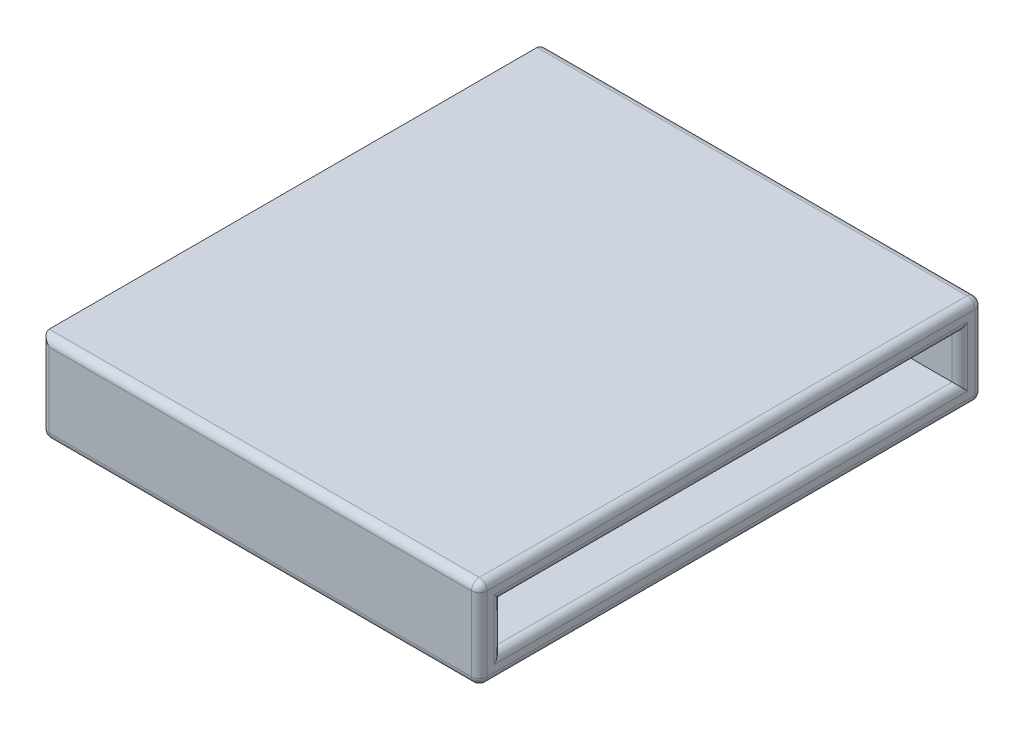
ISO-10303-21;
HEADER;
FILE_DESCRIPTION(('STEP AP214'),'2;1');
FILE_NAME('part.step','',(''),(''),'','','');
FILE_SCHEMA(('AUTOMOTIVE_DESIGN { 1 0 10303 214 1 1 1 1 }'));
ENDSEC;
DATA;
#1=APPLICATION_CONTEXT('core data for automotive mechanical design processes');
#2=APPLICATION_PROTOCOL_DEFINITION('international standard','automotive_design',2000,#1);
#3=PRODUCT_CONTEXT('',#1,'mechanical');
#4=PRODUCT('Part','Part','',(#3));
#5=PRODUCT_RELATED_PRODUCT_CATEGORY('part','',(#4));
#6=PRODUCT_DEFINITION_FORMATION('','',#4);
#7=PRODUCT_DEFINITION_CONTEXT('part definition',#1,'design');
#8=PRODUCT_DEFINITION('design','',#6,#7);
#9=PRODUCT_DEFINITION_SHAPE('','',#8);
#10=(LENGTH_UNIT() NAMED_UNIT(*) SI_UNIT(.MILLI.,.METRE.));
#11=(NAMED_UNIT(*) PLANE_ANGLE_UNIT() SI_UNIT($,.RADIAN.));
#12=(NAMED_UNIT(*) SI_UNIT($,.STERADIAN.) SOLID_ANGLE_UNIT());
#13=UNCERTAINTY_MEASURE_WITH_UNIT(LENGTH_MEASURE(1.E-05),#10,'distance_accuracy_value','');
#14=(GEOMETRIC_REPRESENTATION_CONTEXT(3) GLOBAL_UNCERTAINTY_ASSIGNED_CONTEXT((#13)) GLOBAL_UNIT_ASSIGNED_CONTEXT((#10,
#11,#12)) REPRESENTATION_CONTEXT('',''));
#15=CARTESIAN_POINT('',(0.,0.,0.));
#16=DIRECTION('',(0.,0.,1.));
#17=DIRECTION('',(1.,0.,0.));
#18=AXIS2_PLACEMENT_3D('',#15,#16,#17);
#19=CARTESIAN_POINT('',(0.,11.5,0.));
#20=DIRECTION('',(0.,1.,0.));
#21=DIRECTION('',(0.,0.,1.));
#22=AXIS2_PLACEMENT_3D('',#19,#20,#21);
#23=PLANE('',#22);
#24=DIRECTION('',(0.,0.,-1.));
#25=VECTOR('',#24,1.);
#26=CARTESIAN_POINT('',(-28.,11.5,0.));
#27=LINE('',#26,#25);
#28=CARTESIAN_POINT('',(-28.,11.5,31.185));
#29=VERTEX_POINT('',#28);
#30=CARTESIAN_POINT('',(-28.,11.5,-31.185));
#31=VERTEX_POINT('',#30);
#32=EDGE_CURVE('E304',#29,#31,#27,.T.);
#33=ORIENTED_EDGE('',*,*,#32,.F.);
#34=DIRECTION('',(1.,0.,0.));
#35=VECTOR('',#34,1.);
#36=CARTESIAN_POINT('',(28.,11.5,31.185));
#37=LINE('',#36,#35);
#38=CARTESIAN_POINT('',(27.,11.5,31.185));
#39=VERTEX_POINT('',#38);
#40=EDGE_CURVE('E353',#29,#39,#37,.T.);
#41=ORIENTED_EDGE('',*,*,#40,.T.);
#42=DIRECTION('',(0.,0.,-1.));
#43=VECTOR('',#42,1.);
#44=CARTESIAN_POINT('',(27.,11.5,-32.185));
#45=LINE('',#44,#43);
#46=CARTESIAN_POINT('',(27.,11.5,-31.185));
#47=VERTEX_POINT('',#46);
#48=EDGE_CURVE('E349',#39,#47,#45,.T.);
#49=ORIENTED_EDGE('',*,*,#48,.T.);
#50=DIRECTION('',(1.,0.,0.));
#51=VECTOR('',#50,1.);
#52=CARTESIAN_POINT('',(0.,11.5,-31.185));
#53=LINE('',#52,#51);
#54=EDGE_CURVE('E346',#47,#31,#53,.F.);
#55=ORIENTED_EDGE('',*,*,#54,.T.);
#56=EDGE_LOOP('',(#33,#41,#49,#55));
#57=FACE_BOUND('',#56,.T.);
#58=ADVANCED_FACE('F119',(#57),#23,.T.);
#59=CARTESIAN_POINT('',(0.,0.,0.));
#60=DIRECTION('',(0.,1.,0.));
#61=DIRECTION('',(0.,0.,1.));
#62=AXIS2_PLACEMENT_3D('',#59,#60,#61);
#63=PLANE('',#62);
#64=DIRECTION('',(0.,0.,-1.));
#65=VECTOR('',#64,1.);
#66=CARTESIAN_POINT('',(27.,0.,0.));
#67=LINE('',#66,#65);
#68=CARTESIAN_POINT('',(27.,0.,-31.185));
#69=VERTEX_POINT('',#68);
#70=CARTESIAN_POINT('',(27.,0.,31.185));
#71=VERTEX_POINT('',#70);
#72=EDGE_CURVE('E397',#69,#71,#67,.F.);
#73=ORIENTED_EDGE('',*,*,#72,.T.);
#74=DIRECTION('',(1.,0.,0.));
#75=VECTOR('',#74,1.);
#76=CARTESIAN_POINT('',(0.,0.,31.185));
#77=LINE('',#76,#75);
#78=CARTESIAN_POINT('',(-27.,0.,31.185));
#79=VERTEX_POINT('',#78);
#80=EDGE_CURVE('E400',#71,#79,#77,.F.);
#81=ORIENTED_EDGE('',*,*,#80,.T.);
#82=DIRECTION('',(0.,0.,-1.));
#83=VECTOR('',#82,1.);
#84=CARTESIAN_POINT('',(-27.,0.,-32.185));
#85=LINE('',#84,#83);
#86=CARTESIAN_POINT('',(-27.,0.,-31.185));
#87=VERTEX_POINT('',#86);
#88=EDGE_CURVE('E394',#79,#87,#85,.T.);
#89=ORIENTED_EDGE('',*,*,#88,.T.);
#90=DIRECTION('',(1.,0.,0.));
#91=VECTOR('',#90,1.);
#92=CARTESIAN_POINT('',(28.,0.,-31.185));
#93=LINE('',#92,#91);
#94=EDGE_CURVE('E391',#87,#69,#93,.T.);
#95=ORIENTED_EDGE('',*,*,#94,.T.);
#96=EDGE_LOOP('',(#73,#81,#89,#95));
#97=FACE_BOUND('',#96,.T.);
#98=ADVANCED_FACE('F554',(#97),#63,.F.);
#99=CARTESIAN_POINT('',(0.,11.5,32.185));
#100=DIRECTION('',(0.,0.,-1.));
#101=DIRECTION('',(-1.,0.,0.));
#102=AXIS2_PLACEMENT_3D('',#99,#100,#101);
#103=PLANE('',#102);
#104=DIRECTION('',(1.,0.,0.));
#105=VECTOR('',#104,1.);
#106=CARTESIAN_POINT('',(-28.,10.5,32.185));
#107=LINE('',#106,#105);
#108=CARTESIAN_POINT('',(27.,10.5,32.185));
#109=VERTEX_POINT('',#108);
#110=CARTESIAN_POINT('',(-27.,10.5,32.185));
#111=VERTEX_POINT('',#110);
#112=EDGE_CURVE('E362',#109,#111,#107,.F.);
#113=ORIENTED_EDGE('',*,*,#112,.T.);
#114=DIRECTION('',(0.,-1.,0.));
#115=VECTOR('',#114,1.);
#116=CARTESIAN_POINT('',(-27.,0.,32.185));
#117=LINE('',#116,#115);
#118=CARTESIAN_POINT('',(-27.,1.,32.185));
#119=VERTEX_POINT('',#118);
#120=EDGE_CURVE('E365',#111,#119,#117,.T.);
#121=ORIENTED_EDGE('',*,*,#120,.T.);
#122=DIRECTION('',(1.,0.,0.));
#123=VECTOR('',#122,1.);
#124=CARTESIAN_POINT('',(0.,1.,32.185));
#125=LINE('',#124,#123);
#126=CARTESIAN_POINT('',(27.,1.,32.185));
#127=VERTEX_POINT('',#126);
#128=EDGE_CURVE('E356',#119,#127,#125,.T.);
#129=ORIENTED_EDGE('',*,*,#128,.T.);
#130=DIRECTION('',(0.,-1.,0.));
#131=VECTOR('',#130,1.);
#132=CARTESIAN_POINT('',(27.,11.5,32.185));
#133=LINE('',#132,#131);
#134=EDGE_CURVE('E359',#127,#109,#133,.F.);
#135=ORIENTED_EDGE('',*,*,#134,.T.);
#136=EDGE_LOOP('',(#113,#121,#129,#135));
#137=FACE_BOUND('',#136,.T.);
#138=ADVANCED_FACE('F557',(#137),#103,.F.);
#139=CARTESIAN_POINT('',(28.,11.5,0.));
#140=DIRECTION('',(-1.,0.,0.));
#141=DIRECTION('',(0.,0.,1.));
#142=AXIS2_PLACEMENT_3D('',#139,#140,#141);
#143=PLANE('',#142);
#144=DIRECTION('',(0.,1.,0.));
#145=VECTOR('',#144,1.);
#146=CARTESIAN_POINT('',(28.,11.5,30.285));
#147=LINE('',#146,#145);
#148=CARTESIAN_POINT('',(28.,1.9,30.285));
#149=VERTEX_POINT('',#148);
#150=CARTESIAN_POINT('',(28.,9.6,30.285));
#151=VERTEX_POINT('',#150);
#152=EDGE_CURVE('E328',#149,#151,#147,.T.);
#153=ORIENTED_EDGE('',*,*,#152,.T.);
#154=DIRECTION('',(0.,0.,1.));
#155=VECTOR('',#154,1.);
#156=CARTESIAN_POINT('',(28.,9.6,-29.285));
#157=LINE('',#156,#155);
#158=CARTESIAN_POINT('',(28.,9.6,-30.285));
#159=VERTEX_POINT('',#158);
#160=EDGE_CURVE('E258',#151,#159,#157,.F.);
#161=ORIENTED_EDGE('',*,*,#160,.T.);
#162=DIRECTION('',(0.,1.,0.));
#163=VECTOR('',#162,1.);
#164=CARTESIAN_POINT('',(28.,2.9,-30.285));
#165=LINE('',#164,#163);
#166=CARTESIAN_POINT('',(28.,1.9,-30.285));
#167=VERTEX_POINT('',#166);
#168=EDGE_CURVE('E322',#159,#167,#165,.F.);
#169=ORIENTED_EDGE('',*,*,#168,.T.);
#170=DIRECTION('',(0.,0.,1.));
#171=VECTOR('',#170,1.);
#172=CARTESIAN_POINT('',(28.,1.9,0.));
#173=LINE('',#172,#171);
#174=EDGE_CURVE('E325',#167,#149,#173,.T.);
#175=ORIENTED_EDGE('',*,*,#174,.T.);
#176=EDGE_LOOP('',(#153,#161,#169,#175));
#177=FACE_BOUND('',#176,.T.);
#178=DIRECTION('',(0.,-1.,0.));
#179=VECTOR('',#178,1.);
#180=CARTESIAN_POINT('',(28.,11.5,-31.185));
#181=LINE('',#180,#179);
#182=CARTESIAN_POINT('',(28.,1.,-31.185));
#183=VERTEX_POINT('',#182);
#184=CARTESIAN_POINT('',(28.,10.5,-31.185));
#185=VERTEX_POINT('',#184);
#186=EDGE_CURVE('E287',#183,#185,#181,.F.);
#187=ORIENTED_EDGE('',*,*,#186,.T.);
#188=DIRECTION('',(0.,0.,-1.));
#189=VECTOR('',#188,1.);
#190=CARTESIAN_POINT('',(28.,10.5,32.185));
#191=LINE('',#190,#189);
#192=CARTESIAN_POINT('',(28.,10.5,31.185));
#193=VERTEX_POINT('',#192);
#194=EDGE_CURVE('E318',#185,#193,#191,.F.);
#195=ORIENTED_EDGE('',*,*,#194,.T.);
#196=DIRECTION('',(0.,-1.,0.));
#197=VECTOR('',#196,1.);
#198=CARTESIAN_POINT('',(28.,11.5,31.185));
#199=LINE('',#198,#197);
#200=CARTESIAN_POINT('',(28.,1.,31.185));
#201=VERTEX_POINT('',#200);
#202=EDGE_CURVE('E315',#193,#201,#199,.T.);
#203=ORIENTED_EDGE('',*,*,#202,.T.);
#204=DIRECTION('',(0.,0.,-1.));
#205=VECTOR('',#204,1.);
#206=CARTESIAN_POINT('',(28.,1.,0.));
#207=LINE('',#206,#205);
#208=EDGE_CURVE('E312',#201,#183,#207,.T.);
#209=ORIENTED_EDGE('',*,*,#208,.T.);
#210=EDGE_LOOP('',(#187,#195,#203,#209));
#211=FACE_BOUND('',#210,.T.);
#212=ADVANCED_FACE('F534',(#177,#211),#143,.F.);
#213=CARTESIAN_POINT('',(0.,11.5,-32.185));
#214=DIRECTION('',(0.,0.,-1.));
#215=DIRECTION('',(-1.,0.,0.));
#216=AXIS2_PLACEMENT_3D('',#213,#214,#215);
#217=PLANE('',#216);
#218=DIRECTION('',(1.,0.,0.));
#219=VECTOR('',#218,1.);
#220=CARTESIAN_POINT('',(0.,10.5,-32.185));
#221=LINE('',#220,#219);
#222=CARTESIAN_POINT('',(-27.,10.5,-32.185));
#223=VERTEX_POINT('',#222);
#224=CARTESIAN_POINT('',(27.,10.5,-32.185));
#225=VERTEX_POINT('',#224);
#226=EDGE_CURVE('E129',#223,#225,#221,.T.);
#227=ORIENTED_EDGE('',*,*,#226,.T.);
#228=DIRECTION('',(0.,-1.,0.));
#229=VECTOR('',#228,1.);
#230=CARTESIAN_POINT('',(27.,0.,-32.185));
#231=LINE('',#230,#229);
#232=CARTESIAN_POINT('',(27.,1.,-32.185));
#233=VERTEX_POINT('',#232);
#234=EDGE_CURVE('E12',#225,#233,#231,.T.);
#235=ORIENTED_EDGE('',*,*,#234,.T.);
#236=DIRECTION('',(1.,0.,0.));
#237=VECTOR('',#236,1.);
#238=CARTESIAN_POINT('',(-28.,1.,-32.185));
#239=LINE('',#238,#237);
#240=CARTESIAN_POINT('',(-27.,1.,-32.185));
#241=VERTEX_POINT('',#240);
#242=EDGE_CURVE('E404',#233,#241,#239,.F.);
#243=ORIENTED_EDGE('',*,*,#242,.T.);
#244=DIRECTION('',(0.,-1.,0.));
#245=VECTOR('',#244,1.);
#246=CARTESIAN_POINT('',(-27.,11.5,-32.185));
#247=LINE('',#246,#245);
#248=EDGE_CURVE('E140',#241,#223,#247,.F.);
#249=ORIENTED_EDGE('',*,*,#248,.T.);
#250=EDGE_LOOP('',(#227,#235,#243,#249));
#251=FACE_BOUND('',#250,.T.);
#252=ADVANCED_FACE('F549',(#251),#217,.T.);
#253=CARTESIAN_POINT('',(-28.,11.5,0.));
#254=DIRECTION('',(-1.,0.,0.));
#255=DIRECTION('',(0.,0.,1.));
#256=AXIS2_PLACEMENT_3D('',#253,#254,#255);
#257=PLANE('',#256);
#258=DIRECTION('',(0.,0.,1.));
#259=VECTOR('',#258,1.);
#260=CARTESIAN_POINT('',(-28.,9.6,0.));
#261=LINE('',#260,#259);
#262=CARTESIAN_POINT('',(-28.,9.6,-30.285));
#263=VERTEX_POINT('',#262);
#264=CARTESIAN_POINT('',(-28.,9.6,30.285));
#265=VERTEX_POINT('',#264);
#266=EDGE_CURVE('E375',#263,#265,#261,.T.);
#267=ORIENTED_EDGE('',*,*,#266,.T.);
#268=DIRECTION('',(0.,1.,0.));
#269=VECTOR('',#268,1.);
#270=CARTESIAN_POINT('',(-28.,2.9,30.285));
#271=LINE('',#270,#269);
#272=CARTESIAN_POINT('',(-28.,1.9,30.285));
#273=VERTEX_POINT('',#272);
#274=EDGE_CURVE('E378',#265,#273,#271,.F.);
#275=ORIENTED_EDGE('',*,*,#274,.T.);
#276=DIRECTION('',(0.,0.,1.));
#277=VECTOR('',#276,1.);
#278=CARTESIAN_POINT('',(-28.,1.9,-29.285));
#279=LINE('',#278,#277);
#280=CARTESIAN_POINT('',(-28.,1.9,-30.285));
#281=VERTEX_POINT('',#280);
#282=EDGE_CURVE('E369',#273,#281,#279,.F.);
#283=ORIENTED_EDGE('',*,*,#282,.T.);
#284=DIRECTION('',(0.,1.,0.));
#285=VECTOR('',#284,1.);
#286=CARTESIAN_POINT('',(-28.,11.5,-30.285));
#287=LINE('',#286,#285);
#288=EDGE_CURVE('E372',#281,#263,#287,.T.);
#289=ORIENTED_EDGE('',*,*,#288,.T.);
#290=EDGE_LOOP('',(#267,#275,#283,#289));
#291=FACE_BOUND('',#290,.T.);
#292=DIRECTION('',(0.,0.,-1.));
#293=VECTOR('',#292,1.);
#294=CARTESIAN_POINT('',(-28.,1.,32.185));
#295=LINE('',#294,#293);
#296=CARTESIAN_POINT('',(-28.,1.,-31.185));
#297=VERTEX_POINT('',#296);
#298=CARTESIAN_POINT('',(-28.,1.,31.185));
#299=VERTEX_POINT('',#298);
#300=EDGE_CURVE('E385',#297,#299,#295,.F.);
#301=ORIENTED_EDGE('',*,*,#300,.T.);
#302=DIRECTION('',(0.,-1.,0.));
#303=VECTOR('',#302,1.);
#304=CARTESIAN_POINT('',(-28.,11.5,31.185));
#305=LINE('',#304,#303);
#306=EDGE_CURVE('E388',#299,#29,#305,.F.);
#307=ORIENTED_EDGE('',*,*,#306,.T.);
#308=ORIENTED_EDGE('',*,*,#32,.T.);
#309=DIRECTION('',(0.,-1.,0.));
#310=VECTOR('',#309,1.);
#311=CARTESIAN_POINT('',(-28.,11.5,-31.185));
#312=LINE('',#311,#310);
#313=EDGE_CURVE('E382',#31,#297,#312,.T.);
#314=ORIENTED_EDGE('',*,*,#313,.T.);
#315=EDGE_LOOP('',(#301,#307,#308,#314));
#316=FACE_BOUND('',#315,.T.);
#317=ADVANCED_FACE('F516',(#291,#316),#257,.T.);
#318=CARTESIAN_POINT('',(75.,2.9,0.));
#319=DIRECTION('',(0.,-1.,0.));
#320=DIRECTION('',(0.,0.,-1.));
#321=AXIS2_PLACEMENT_3D('',#318,#319,#320);
#322=PLANE('',#321);
#323=DIRECTION('',(-1.,0.,0.));
#324=VECTOR('',#323,1.);
#325=CARTESIAN_POINT('',(75.,2.9,29.285));
#326=LINE('',#325,#324);
#327=CARTESIAN_POINT('',(27.,2.9,29.285));
#328=VERTEX_POINT('',#327);
#329=CARTESIAN_POINT('',(-27.,2.9,29.285));
#330=VERTEX_POINT('',#329);
#331=EDGE_CURVE('E294',#328,#330,#326,.T.);
#332=ORIENTED_EDGE('',*,*,#331,.F.);
#333=DIRECTION('',(0.,0.,1.));
#334=VECTOR('',#333,1.);
#335=CARTESIAN_POINT('',(27.,2.9,0.));
#336=LINE('',#335,#334);
#337=CARTESIAN_POINT('',(27.,2.9,-29.285));
#338=VERTEX_POINT('',#337);
#339=EDGE_CURVE('E337',#328,#338,#336,.F.);
#340=ORIENTED_EDGE('',*,*,#339,.T.);
#341=DIRECTION('',(-1.,0.,0.));
#342=VECTOR('',#341,1.);
#343=CARTESIAN_POINT('',(75.,2.9,-29.285));
#344=LINE('',#343,#342);
#345=CARTESIAN_POINT('',(-27.,2.9,-29.285));
#346=VERTEX_POINT('',#345);
#347=EDGE_CURVE('E298',#338,#346,#344,.T.);
#348=ORIENTED_EDGE('',*,*,#347,.T.);
#349=DIRECTION('',(0.,0.,1.));
#350=VECTOR('',#349,1.);
#351=CARTESIAN_POINT('',(-27.,2.9,29.285));
#352=LINE('',#351,#350);
#353=EDGE_CURVE('E275',#346,#330,#352,.T.);
#354=ORIENTED_EDGE('',*,*,#353,.T.);
#355=EDGE_LOOP('',(#332,#340,#348,#354));
#356=FACE_BOUND('',#355,.T.);
#357=ADVANCED_FACE('F540',(#356),#322,.F.);
#358=CARTESIAN_POINT('',(75.,0.,-29.285));
#359=DIRECTION('',(0.,0.,1.));
#360=DIRECTION('',(1.,0.,0.));
#361=AXIS2_PLACEMENT_3D('',#358,#359,#360);
#362=PLANE('',#361);
#363=ORIENTED_EDGE('',*,*,#347,.F.);
#364=DIRECTION('',(0.,1.,0.));
#365=VECTOR('',#364,1.);
#366=CARTESIAN_POINT('',(27.,8.6,-29.285));
#367=LINE('',#366,#365);
#368=CARTESIAN_POINT('',(27.,8.6,-29.285));
#369=VERTEX_POINT('',#368);
#370=EDGE_CURVE('E343',#338,#369,#367,.T.);
#371=ORIENTED_EDGE('',*,*,#370,.T.);
#372=DIRECTION('',(-1.,0.,0.));
#373=VECTOR('',#372,1.);
#374=CARTESIAN_POINT('',(75.,8.6,-29.285));
#375=LINE('',#374,#373);
#376=CARTESIAN_POINT('',(-27.,8.6,-29.285));
#377=VERTEX_POINT('',#376);
#378=EDGE_CURVE('E284',#369,#377,#375,.T.);
#379=ORIENTED_EDGE('',*,*,#378,.T.);
#380=DIRECTION('',(0.,1.,0.));
#381=VECTOR('',#380,1.);
#382=CARTESIAN_POINT('',(-27.,0.,-29.285));
#383=LINE('',#382,#381);
#384=EDGE_CURVE('E340',#377,#346,#383,.F.);
#385=ORIENTED_EDGE('',*,*,#384,.T.);
#386=EDGE_LOOP('',(#363,#371,#379,#385));
#387=FACE_BOUND('',#386,.T.);
#388=ADVANCED_FACE('F525',(#387),#362,.T.);
#389=CARTESIAN_POINT('',(75.,8.6,0.));
#390=DIRECTION('',(0.,-1.,0.));
#391=DIRECTION('',(0.,0.,-1.));
#392=AXIS2_PLACEMENT_3D('',#389,#390,#391);
#393=PLANE('',#392);
#394=ORIENTED_EDGE('',*,*,#378,.F.);
#395=DIRECTION('',(0.,0.,1.));
#396=VECTOR('',#395,1.);
#397=CARTESIAN_POINT('',(27.,8.6,29.285));
#398=LINE('',#397,#396);
#399=CARTESIAN_POINT('',(27.,8.6,29.285));
#400=VERTEX_POINT('',#399);
#401=EDGE_CURVE('E256',#369,#400,#398,.T.);
#402=ORIENTED_EDGE('',*,*,#401,.T.);
#403=DIRECTION('',(-1.,0.,0.));
#404=VECTOR('',#403,1.);
#405=CARTESIAN_POINT('',(75.,8.6,29.285));
#406=LINE('',#405,#404);
#407=CARTESIAN_POINT('',(-27.,8.6,29.285));
#408=VERTEX_POINT('',#407);
#409=EDGE_CURVE('E282',#400,#408,#406,.T.);
#410=ORIENTED_EDGE('',*,*,#409,.T.);
#411=DIRECTION('',(0.,0.,1.));
#412=VECTOR('',#411,1.);
#413=CARTESIAN_POINT('',(-27.,8.6,0.));
#414=LINE('',#413,#412);
#415=EDGE_CURVE('E288',#408,#377,#414,.F.);
#416=ORIENTED_EDGE('',*,*,#415,.T.);
#417=EDGE_LOOP('',(#394,#402,#410,#416));
#418=FACE_BOUND('',#417,.T.);
#419=ADVANCED_FACE('F281',(#418),#393,.T.);
#420=CARTESIAN_POINT('',(75.,0.,29.285));
#421=DIRECTION('',(0.,0.,1.));
#422=DIRECTION('',(1.,0.,0.));
#423=AXIS2_PLACEMENT_3D('',#420,#421,#422);
#424=PLANE('',#423);
#425=ORIENTED_EDGE('',*,*,#409,.F.);
#426=DIRECTION('',(0.,1.,0.));
#427=VECTOR('',#426,1.);
#428=CARTESIAN_POINT('',(27.,0.,29.285));
#429=LINE('',#428,#427);
#430=EDGE_CURVE('E266',#400,#328,#429,.F.);
#431=ORIENTED_EDGE('',*,*,#430,.T.);
#432=ORIENTED_EDGE('',*,*,#331,.T.);
#433=DIRECTION('',(0.,1.,0.));
#434=VECTOR('',#433,1.);
#435=CARTESIAN_POINT('',(-27.,8.6,29.285));
#436=LINE('',#435,#434);
#437=EDGE_CURVE('E276',#330,#408,#436,.T.);
#438=ORIENTED_EDGE('',*,*,#437,.T.);
#439=EDGE_LOOP('',(#425,#431,#432,#438));
#440=FACE_BOUND('',#439,.T.);
#441=ADVANCED_FACE('F291',(#440),#424,.F.);
#442=CARTESIAN_POINT('',(27.,1.9,0.));
#443=DIRECTION('',(0.,0.,1.));
#444=DIRECTION('',(1.,0.,0.));
#445=AXIS2_PLACEMENT_3D('',#442,#443,#444);
#446=CYLINDRICAL_SURFACE('',#445,1.);
#447=CARTESIAN_POINT('',(27.,1.9,30.285));
#448=DIRECTION('',(0.,0.707106781186547,0.707106781186547));
#449=DIRECTION('',(0.,0.707106781186547,-0.707106781186547));
#450=AXIS2_PLACEMENT_3D('',#447,#448,#449);
#451=ELLIPSE('',#450,1.41421356237309,1.);
#452=EDGE_CURVE('E269',#149,#328,#451,.T.);
#453=ORIENTED_EDGE('',*,*,#452,.F.);
#454=ORIENTED_EDGE('',*,*,#174,.F.);
#455=CARTESIAN_POINT('',(27.,1.9,-30.285));
#456=DIRECTION('',(0.,-0.707106781186547,0.707106781186547));
#457=DIRECTION('',(0.,0.707106781186547,0.707106781186547));
#458=AXIS2_PLACEMENT_3D('',#455,#456,#457);
#459=ELLIPSE('',#458,1.41421356237309,1.);
#460=EDGE_CURVE('E300',#338,#167,#459,.F.);
#461=ORIENTED_EDGE('',*,*,#460,.F.);
#462=ORIENTED_EDGE('',*,*,#339,.F.);
#463=EDGE_LOOP('',(#453,#454,#461,#462));
#464=FACE_BOUND('',#463,.T.);
#465=ADVANCED_FACE('F538',(#464),#446,.T.);
#466=CARTESIAN_POINT('',(27.,0.,-30.285));
#467=DIRECTION('',(0.,-1.,0.));
#468=DIRECTION('',(0.,0.,-1.));
#469=AXIS2_PLACEMENT_3D('',#466,#467,#468);
#470=CYLINDRICAL_SURFACE('',#469,1.);
#471=ORIENTED_EDGE('',*,*,#460,.T.);
#472=ORIENTED_EDGE('',*,*,#168,.F.);
#473=CARTESIAN_POINT('',(27.,9.6,-30.285));
#474=DIRECTION('',(0.,-0.707106781186547,-0.707106781186547));
#475=DIRECTION('',(0.,0.707106781186547,-0.707106781186547));
#476=AXIS2_PLACEMENT_3D('',#473,#474,#475);
#477=ELLIPSE('',#476,1.41421356237309,1.);
#478=EDGE_CURVE('E262',#369,#159,#477,.F.);
#479=ORIENTED_EDGE('',*,*,#478,.F.);
#480=ORIENTED_EDGE('',*,*,#370,.F.);
#481=EDGE_LOOP('',(#471,#472,#479,#480));
#482=FACE_BOUND('',#481,.T.);
#483=ADVANCED_FACE('F530',(#482),#470,.T.);
#484=CARTESIAN_POINT('',(27.,11.5,30.285));
#485=DIRECTION('',(0.,1.,0.));
#486=DIRECTION('',(0.,0.,1.));
#487=AXIS2_PLACEMENT_3D('',#484,#485,#486);
#488=CYLINDRICAL_SURFACE('',#487,1.);
#489=ORIENTED_EDGE('',*,*,#452,.T.);
#490=ORIENTED_EDGE('',*,*,#430,.F.);
#491=CARTESIAN_POINT('',(27.,9.6,30.285));
#492=DIRECTION('',(0.,0.707106781186547,-0.707106781186547));
#493=DIRECTION('',(0.,-0.707106781186547,-0.707106781186547));
#494=AXIS2_PLACEMENT_3D('',#491,#492,#493);
#495=ELLIPSE('',#494,1.41421356237309,1.);
#496=EDGE_CURVE('E252',#151,#400,#495,.T.);
#497=ORIENTED_EDGE('',*,*,#496,.F.);
#498=ORIENTED_EDGE('',*,*,#152,.F.);
#499=EDGE_LOOP('',(#489,#490,#497,#498));
#500=FACE_BOUND('',#499,.T.);
#501=ADVANCED_FACE('F267',(#500),#488,.T.);
#502=CARTESIAN_POINT('',(27.,9.6,0.));
#503=DIRECTION('',(0.,0.,-1.));
#504=DIRECTION('',(-1.,0.,0.));
#505=AXIS2_PLACEMENT_3D('',#502,#503,#504);
#506=CYLINDRICAL_SURFACE('',#505,1.);
#507=ORIENTED_EDGE('',*,*,#478,.T.);
#508=ORIENTED_EDGE('',*,*,#160,.F.);
#509=ORIENTED_EDGE('',*,*,#496,.T.);
#510=ORIENTED_EDGE('',*,*,#401,.F.);
#511=EDGE_LOOP('',(#507,#508,#509,#510));
#512=FACE_BOUND('',#511,.T.);
#513=ADVANCED_FACE('F254',(#512),#506,.T.);
#514=CARTESIAN_POINT('',(-27.,1.,0.));
#515=DIRECTION('',(0.,0.,1.));
#516=DIRECTION('',(1.,0.,0.));
#517=AXIS2_PLACEMENT_3D('',#514,#515,#516);
#518=CYLINDRICAL_SURFACE('',#517,1.);
#519=CARTESIAN_POINT('',(-27.,1.,-31.185));
#520=DIRECTION('',(0.,0.,-1.));
#521=DIRECTION('',(-1.,0.,0.));
#522=AXIS2_PLACEMENT_3D('',#519,#520,#521);
#523=CIRCLE('',#522,1.);
#524=EDGE_CURVE('E482',#87,#297,#523,.T.);
#525=ORIENTED_EDGE('',*,*,#524,.F.);
#526=ORIENTED_EDGE('',*,*,#88,.F.);
#527=CARTESIAN_POINT('',(-27.,1.,31.185));
#528=DIRECTION('',(0.,0.,1.));
#529=DIRECTION('',(1.,0.,0.));
#530=AXIS2_PLACEMENT_3D('',#527,#528,#529);
#531=CIRCLE('',#530,1.);
#532=EDGE_CURVE('E486',#299,#79,#531,.T.);
#533=ORIENTED_EDGE('',*,*,#532,.F.);
#534=ORIENTED_EDGE('',*,*,#300,.F.);
#535=EDGE_LOOP('',(#525,#526,#533,#534));
#536=FACE_BOUND('',#535,.T.);
#537=ADVANCED_FACE('F572',(#536),#518,.T.);
#538=CARTESIAN_POINT('',(0.,1.,31.185));
#539=DIRECTION('',(1.,0.,0.));
#540=DIRECTION('',(0.,0.,-1.));
#541=AXIS2_PLACEMENT_3D('',#538,#539,#540);
#542=CYLINDRICAL_SURFACE('',#541,1.);
#543=CARTESIAN_POINT('',(-27.,1.,31.185));
#544=DIRECTION('',(-1.,0.,0.));
#545=DIRECTION('',(0.,0.,1.));
#546=AXIS2_PLACEMENT_3D('',#543,#544,#545);
#547=CIRCLE('',#546,1.);
#548=EDGE_CURVE('E263',#79,#119,#547,.T.);
#549=ORIENTED_EDGE('',*,*,#548,.F.);
#550=ORIENTED_EDGE('',*,*,#80,.F.);
#551=CARTESIAN_POINT('',(27.,1.,31.185));
#552=DIRECTION('',(1.,0.,0.));
#553=DIRECTION('',(0.,0.,-1.));
#554=AXIS2_PLACEMENT_3D('',#551,#552,#553);
#555=CIRCLE('',#554,1.);
#556=EDGE_CURVE('E470',#127,#71,#555,.T.);
#557=ORIENTED_EDGE('',*,*,#556,.F.);
#558=ORIENTED_EDGE('',*,*,#128,.F.);
#559=EDGE_LOOP('',(#549,#550,#557,#558));
#560=FACE_BOUND('',#559,.T.);
#561=ADVANCED_FACE('F638',(#560),#542,.T.);
#562=CARTESIAN_POINT('',(-27.,1.,31.185));
#563=DIRECTION('',(0.,-1.,0.));
#564=DIRECTION('',(0.,0.,-1.));
#565=AXIS2_PLACEMENT_3D('',#562,#563,#564);
#566=SPHERICAL_SURFACE('',#565,1.);
#567=ORIENTED_EDGE('',*,*,#532,.T.);
#568=ORIENTED_EDGE('',*,*,#548,.T.);
#569=CARTESIAN_POINT('',(-27.,1.,31.185));
#570=DIRECTION('',(0.,-1.,0.));
#571=DIRECTION('',(1.,0.,0.));
#572=AXIS2_PLACEMENT_3D('',#569,#570,#571);
#573=CIRCLE('',#572,1.);
#574=EDGE_CURVE('E467',#299,#119,#573,.F.);
#575=ORIENTED_EDGE('',*,*,#574,.F.);
#576=EDGE_LOOP('',(#567,#568,#575));
#577=FACE_BOUND('',#576,.T.);
#578=ADVANCED_FACE('F634',(#577),#566,.T.);
#579=CARTESIAN_POINT('',(-27.,1.,-31.185));
#580=DIRECTION('',(0.,-1.,0.));
#581=DIRECTION('',(0.,0.,-1.));
#582=AXIS2_PLACEMENT_3D('',#579,#580,#581);
#583=SPHERICAL_SURFACE('',#582,1.);
#584=CARTESIAN_POINT('',(-27.,1.,-31.185));
#585=DIRECTION('',(0.,-1.,0.));
#586=DIRECTION('',(0.,0.,-1.));
#587=AXIS2_PLACEMENT_3D('',#584,#585,#586);
#588=CIRCLE('',#587,1.);
#589=EDGE_CURVE('E463',#241,#297,#588,.F.);
#590=ORIENTED_EDGE('',*,*,#589,.F.);
#591=CARTESIAN_POINT('',(-27.,1.,-31.185));
#592=DIRECTION('',(-1.,0.,0.));
#593=DIRECTION('',(0.,0.,1.));
#594=AXIS2_PLACEMENT_3D('',#591,#592,#593);
#595=CIRCLE('',#594,1.);
#596=EDGE_CURVE('E478',#87,#241,#595,.F.);
#597=ORIENTED_EDGE('',*,*,#596,.F.);
#598=ORIENTED_EDGE('',*,*,#524,.T.);
#599=EDGE_LOOP('',(#590,#597,#598));
#600=FACE_BOUND('',#599,.T.);
#601=ADVANCED_FACE('F630',(#600),#583,.T.);
#602=CARTESIAN_POINT('',(0.,1.,-31.185));
#603=DIRECTION('',(-1.,0.,0.));
#604=DIRECTION('',(0.,0.,1.));
#605=AXIS2_PLACEMENT_3D('',#602,#603,#604);
#606=CYLINDRICAL_SURFACE('',#605,1.);
#607=ORIENTED_EDGE('',*,*,#596,.T.);
#608=ORIENTED_EDGE('',*,*,#242,.F.);
#609=CARTESIAN_POINT('',(27.,1.,-31.185));
#610=DIRECTION('',(1.,0.,0.));
#611=DIRECTION('',(0.,0.,-1.));
#612=AXIS2_PLACEMENT_3D('',#609,#610,#611);
#613=CIRCLE('',#612,1.);
#614=EDGE_CURVE('E459',#69,#233,#613,.T.);
#615=ORIENTED_EDGE('',*,*,#614,.F.);
#616=ORIENTED_EDGE('',*,*,#94,.F.);
#617=EDGE_LOOP('',(#607,#608,#615,#616));
#618=FACE_BOUND('',#617,.T.);
#619=ADVANCED_FACE('F626',(#618),#606,.T.);
#620=CARTESIAN_POINT('',(27.,1.,0.));
#621=DIRECTION('',(0.,0.,-1.));
#622=DIRECTION('',(-1.,0.,0.));
#623=AXIS2_PLACEMENT_3D('',#620,#621,#622);
#624=CYLINDRICAL_SURFACE('',#623,1.);
#625=CARTESIAN_POINT('',(27.,1.,31.185));
#626=DIRECTION('',(0.,0.,1.));
#627=DIRECTION('',(1.,0.,0.));
#628=AXIS2_PLACEMENT_3D('',#625,#626,#627);
#629=CIRCLE('',#628,1.);
#630=EDGE_CURVE('E474',#71,#201,#629,.T.);
#631=ORIENTED_EDGE('',*,*,#630,.F.);
#632=ORIENTED_EDGE('',*,*,#72,.F.);
#633=CARTESIAN_POINT('',(27.,1.,-31.185));
#634=DIRECTION('',(0.,0.,-1.));
#635=DIRECTION('',(-1.,0.,0.));
#636=AXIS2_PLACEMENT_3D('',#633,#634,#635);
#637=CIRCLE('',#636,1.);
#638=EDGE_CURVE('E455',#183,#69,#637,.T.);
#639=ORIENTED_EDGE('',*,*,#638,.F.);
#640=ORIENTED_EDGE('',*,*,#208,.F.);
#641=EDGE_LOOP('',(#631,#632,#639,#640));
#642=FACE_BOUND('',#641,.T.);
#643=ADVANCED_FACE('F622',(#642),#624,.T.);
#644=CARTESIAN_POINT('',(27.,1.,31.185));
#645=DIRECTION('',(0.,-1.,0.));
#646=DIRECTION('',(0.,0.,-1.));
#647=AXIS2_PLACEMENT_3D('',#644,#645,#646);
#648=SPHERICAL_SURFACE('',#647,1.);
#649=ORIENTED_EDGE('',*,*,#556,.T.);
#650=ORIENTED_EDGE('',*,*,#630,.T.);
#651=CARTESIAN_POINT('',(27.,1.,31.185));
#652=DIRECTION('',(0.,-1.,0.));
#653=DIRECTION('',(0.,0.,-1.));
#654=AXIS2_PLACEMENT_3D('',#651,#652,#653);
#655=CIRCLE('',#654,1.);
#656=EDGE_CURVE('E451',#127,#201,#655,.F.);
#657=ORIENTED_EDGE('',*,*,#656,.F.);
#658=EDGE_LOOP('',(#649,#650,#657));
#659=FACE_BOUND('',#658,.T.);
#660=ADVANCED_FACE('F618',(#659),#648,.T.);
#661=CARTESIAN_POINT('',(-27.,11.5,31.185));
#662=DIRECTION('',(0.,1.,0.));
#663=DIRECTION('',(0.,0.,1.));
#664=AXIS2_PLACEMENT_3D('',#661,#662,#663);
#665=CYLINDRICAL_SURFACE('',#664,1.);
#666=ORIENTED_EDGE('',*,*,#574,.T.);
#667=ORIENTED_EDGE('',*,*,#120,.F.);
#668=CARTESIAN_POINT('',(-27.,10.5,31.185));
#669=DIRECTION('',(-0.707106781186547,-0.707106781186547,0.));
#670=DIRECTION('',(-0.707106781186547,0.707106781186547,0.));
#671=AXIS2_PLACEMENT_3D('',#668,#669,#670);
#672=ELLIPSE('',#671,1.41421356237309,1.);
#673=EDGE_CURVE('E447',#29,#111,#672,.F.);
#674=ORIENTED_EDGE('',*,*,#673,.F.);
#675=ORIENTED_EDGE('',*,*,#306,.F.);
#676=EDGE_LOOP('',(#666,#667,#674,#675));
#677=FACE_BOUND('',#676,.T.);
#678=ADVANCED_FACE('F614',(#677),#665,.T.);
#679=CARTESIAN_POINT('',(-27.,11.5,-31.185));
#680=DIRECTION('',(0.,-1.,0.));
#681=DIRECTION('',(0.,0.,-1.));
#682=AXIS2_PLACEMENT_3D('',#679,#680,#681);
#683=CYLINDRICAL_SURFACE('',#682,1.);
#684=ORIENTED_EDGE('',*,*,#589,.T.);
#685=ORIENTED_EDGE('',*,*,#313,.F.);
#686=CARTESIAN_POINT('',(-27.,10.5,-31.185));
#687=DIRECTION('',(-0.707106781186547,-0.707106781186547,0.));
#688=DIRECTION('',(0.707106781186547,-0.707106781186547,0.));
#689=AXIS2_PLACEMENT_3D('',#686,#687,#688);
#690=ELLIPSE('',#689,1.41421356237309,1.);
#691=EDGE_CURVE('E443',#223,#31,#690,.F.);
#692=ORIENTED_EDGE('',*,*,#691,.F.);
#693=ORIENTED_EDGE('',*,*,#248,.F.);
#694=EDGE_LOOP('',(#684,#685,#692,#693));
#695=FACE_BOUND('',#694,.T.);
#696=ADVANCED_FACE('F610',(#695),#683,.T.);
#697=CARTESIAN_POINT('',(27.,1.,-31.185));
#698=DIRECTION('',(0.,-1.,0.));
#699=DIRECTION('',(1.,0.,0.));
#700=AXIS2_PLACEMENT_3D('',#697,#698,#699);
#701=SPHERICAL_SURFACE('',#700,1.);
#702=ORIENTED_EDGE('',*,*,#638,.T.);
#703=ORIENTED_EDGE('',*,*,#614,.T.);
#704=CARTESIAN_POINT('',(27.,1.,-31.185));
#705=DIRECTION('',(0.,-1.,0.));
#706=DIRECTION('',(1.,0.,0.));
#707=AXIS2_PLACEMENT_3D('',#704,#705,#706);
#708=CIRCLE('',#707,1.);
#709=EDGE_CURVE('E440',#183,#233,#708,.F.);
#710=ORIENTED_EDGE('',*,*,#709,.F.);
#711=EDGE_LOOP('',(#702,#703,#710));
#712=FACE_BOUND('',#711,.T.);
#713=ADVANCED_FACE('F606',(#712),#701,.T.);
#714=CARTESIAN_POINT('',(27.,11.5,31.185));
#715=DIRECTION('',(0.,-1.,0.));
#716=DIRECTION('',(0.,0.,-1.));
#717=AXIS2_PLACEMENT_3D('',#714,#715,#716);
#718=CYLINDRICAL_SURFACE('',#717,1.);
#719=ORIENTED_EDGE('',*,*,#656,.T.);
#720=ORIENTED_EDGE('',*,*,#202,.F.);
#721=CARTESIAN_POINT('',(27.,10.5,31.185));
#722=DIRECTION('',(0.,1.,0.));
#723=DIRECTION('',(0.,0.,1.));
#724=AXIS2_PLACEMENT_3D('',#721,#722,#723);
#725=CIRCLE('',#724,1.);
#726=EDGE_CURVE('E436',#109,#193,#725,.T.);
#727=ORIENTED_EDGE('',*,*,#726,.F.);
#728=ORIENTED_EDGE('',*,*,#134,.F.);
#729=EDGE_LOOP('',(#719,#720,#727,#728));
#730=FACE_BOUND('',#729,.T.);
#731=ADVANCED_FACE('F602',(#730),#718,.T.);
#732=CARTESIAN_POINT('',(0.,10.5,31.185));
#733=DIRECTION('',(-1.,0.,0.));
#734=DIRECTION('',(0.,0.,1.));
#735=AXIS2_PLACEMENT_3D('',#732,#733,#734);
#736=CYLINDRICAL_SURFACE('',#735,1.);
#737=ORIENTED_EDGE('',*,*,#673,.T.);
#738=ORIENTED_EDGE('',*,*,#112,.F.);
#739=CARTESIAN_POINT('',(27.,10.5,31.185));
#740=DIRECTION('',(1.,0.,0.));
#741=DIRECTION('',(0.,0.,-1.));
#742=AXIS2_PLACEMENT_3D('',#739,#740,#741);
#743=CIRCLE('',#742,1.);
#744=EDGE_CURVE('E432',#39,#109,#743,.T.);
#745=ORIENTED_EDGE('',*,*,#744,.F.);
#746=ORIENTED_EDGE('',*,*,#40,.F.);
#747=EDGE_LOOP('',(#737,#738,#745,#746));
#748=FACE_BOUND('',#747,.T.);
#749=ADVANCED_FACE('F598',(#748),#736,.T.);
#750=CARTESIAN_POINT('',(0.,10.5,-31.185));
#751=DIRECTION('',(1.,0.,0.));
#752=DIRECTION('',(0.,0.,-1.));
#753=AXIS2_PLACEMENT_3D('',#750,#751,#752);
#754=CYLINDRICAL_SURFACE('',#753,1.);
#755=ORIENTED_EDGE('',*,*,#691,.T.);
#756=ORIENTED_EDGE('',*,*,#54,.F.);
#757=CARTESIAN_POINT('',(27.,10.5,-31.185));
#758=DIRECTION('',(1.,0.,0.));
#759=DIRECTION('',(0.,0.,-1.));
#760=AXIS2_PLACEMENT_3D('',#757,#758,#759);
#761=CIRCLE('',#760,1.);
#762=EDGE_CURVE('E428',#225,#47,#761,.T.);
#763=ORIENTED_EDGE('',*,*,#762,.F.);
#764=ORIENTED_EDGE('',*,*,#226,.F.);
#765=EDGE_LOOP('',(#755,#756,#763,#764));
#766=FACE_BOUND('',#765,.T.);
#767=ADVANCED_FACE('F594',(#766),#754,.T.);
#768=CARTESIAN_POINT('',(27.,11.5,-31.185));
#769=DIRECTION('',(0.,1.,0.));
#770=DIRECTION('',(0.,0.,1.));
#771=AXIS2_PLACEMENT_3D('',#768,#769,#770);
#772=CYLINDRICAL_SURFACE('',#771,1.);
#773=ORIENTED_EDGE('',*,*,#709,.T.);
#774=ORIENTED_EDGE('',*,*,#234,.F.);
#775=CARTESIAN_POINT('',(27.,10.5,-31.185));
#776=DIRECTION('',(0.,1.,0.));
#777=DIRECTION('',(0.,0.,1.));
#778=AXIS2_PLACEMENT_3D('',#775,#776,#777);
#779=CIRCLE('',#778,1.);
#780=EDGE_CURVE('E424',#185,#225,#779,.T.);
#781=ORIENTED_EDGE('',*,*,#780,.F.);
#782=ORIENTED_EDGE('',*,*,#186,.F.);
#783=EDGE_LOOP('',(#773,#774,#781,#782));
#784=FACE_BOUND('',#783,.T.);
#785=ADVANCED_FACE('F590',(#784),#772,.T.);
#786=CARTESIAN_POINT('',(27.,10.5,31.185));
#787=DIRECTION('',(0.,0.,1.));
#788=DIRECTION('',(1.,0.,0.));
#789=AXIS2_PLACEMENT_3D('',#786,#787,#788);
#790=SPHERICAL_SURFACE('',#789,1.);
#791=ORIENTED_EDGE('',*,*,#744,.T.);
#792=ORIENTED_EDGE('',*,*,#726,.T.);
#793=CARTESIAN_POINT('',(27.,10.5,31.185));
#794=DIRECTION('',(0.,0.,1.));
#795=DIRECTION('',(1.,0.,0.));
#796=AXIS2_PLACEMENT_3D('',#793,#794,#795);
#797=CIRCLE('',#796,1.);
#798=EDGE_CURVE('E421',#39,#193,#797,.F.);
#799=ORIENTED_EDGE('',*,*,#798,.F.);
#800=EDGE_LOOP('',(#791,#792,#799));
#801=FACE_BOUND('',#800,.T.);
#802=ADVANCED_FACE('F586',(#801),#790,.T.);
#803=CARTESIAN_POINT('',(27.,10.5,-31.185));
#804=DIRECTION('',(0.,0.,-1.));
#805=DIRECTION('',(-1.,0.,0.));
#806=AXIS2_PLACEMENT_3D('',#803,#804,#805);
#807=SPHERICAL_SURFACE('',#806,1.);
#808=ORIENTED_EDGE('',*,*,#780,.T.);
#809=ORIENTED_EDGE('',*,*,#762,.T.);
#810=CARTESIAN_POINT('',(27.,10.5,-31.185));
#811=DIRECTION('',(0.,0.,-1.));
#812=DIRECTION('',(-1.,0.,0.));
#813=AXIS2_PLACEMENT_3D('',#810,#811,#812);
#814=CIRCLE('',#813,1.);
#815=EDGE_CURVE('E418',#185,#47,#814,.F.);
#816=ORIENTED_EDGE('',*,*,#815,.F.);
#817=EDGE_LOOP('',(#808,#809,#816));
#818=FACE_BOUND('',#817,.T.);
#819=ADVANCED_FACE('F582',(#818),#807,.T.);
#820=CARTESIAN_POINT('',(27.,10.5,0.));
#821=DIRECTION('',(0.,0.,1.));
#822=DIRECTION('',(1.,0.,0.));
#823=AXIS2_PLACEMENT_3D('',#820,#821,#822);
#824=CYLINDRICAL_SURFACE('',#823,1.);
#825=ORIENTED_EDGE('',*,*,#798,.T.);
#826=ORIENTED_EDGE('',*,*,#194,.F.);
#827=ORIENTED_EDGE('',*,*,#815,.T.);
#828=ORIENTED_EDGE('',*,*,#48,.F.);
#829=EDGE_LOOP('',(#825,#826,#827,#828));
#830=FACE_BOUND('',#829,.T.);
#831=ADVANCED_FACE('F579',(#830),#824,.T.);
#832=CARTESIAN_POINT('',(-27.,11.5,-30.285));
#833=DIRECTION('',(0.,1.,0.));
#834=DIRECTION('',(0.,0.,1.));
#835=AXIS2_PLACEMENT_3D('',#832,#833,#834);
#836=CYLINDRICAL_SURFACE('',#835,1.);
#837=CARTESIAN_POINT('',(-27.,9.6,-30.285));
#838=DIRECTION('',(0.,0.707106781186547,0.707106781186547));
#839=DIRECTION('',(0.,-0.707106781186547,0.707106781186547));
#840=AXIS2_PLACEMENT_3D('',#837,#838,#839);
#841=ELLIPSE('',#840,1.41421356237309,1.);
#842=EDGE_CURVE('E497',#263,#377,#841,.T.);
#843=ORIENTED_EDGE('',*,*,#842,.F.);
#844=ORIENTED_EDGE('',*,*,#288,.F.);
#845=CARTESIAN_POINT('',(-27.,1.9,-30.285));
#846=DIRECTION('',(0.,0.707106781186547,-0.707106781186547));
#847=DIRECTION('',(0.,0.707106781186547,0.707106781186547));
#848=AXIS2_PLACEMENT_3D('',#845,#846,#847);
#849=ELLIPSE('',#848,1.41421356237309,1.);
#850=EDGE_CURVE('E123',#346,#281,#849,.F.);
#851=ORIENTED_EDGE('',*,*,#850,.F.);
#852=ORIENTED_EDGE('',*,*,#384,.F.);
#853=EDGE_LOOP('',(#843,#844,#851,#852));
#854=FACE_BOUND('',#853,.T.);
#855=ADVANCED_FACE('F121',(#854),#836,.T.);
#856=CARTESIAN_POINT('',(-27.,1.9,0.));
#857=DIRECTION('',(0.,0.,-1.));
#858=DIRECTION('',(-1.,0.,0.));
#859=AXIS2_PLACEMENT_3D('',#856,#857,#858);
#860=CYLINDRICAL_SURFACE('',#859,1.);
#861=ORIENTED_EDGE('',*,*,#850,.T.);
#862=ORIENTED_EDGE('',*,*,#282,.F.);
#863=CARTESIAN_POINT('',(-27.,1.9,30.285));
#864=DIRECTION('',(0.,-0.707106781186547,-0.707106781186547));
#865=DIRECTION('',(0.,-0.707106781186547,0.707106781186547));
#866=AXIS2_PLACEMENT_3D('',#863,#864,#865);
#867=ELLIPSE('',#866,1.41421356237309,1.);
#868=EDGE_CURVE('E495',#330,#273,#867,.F.);
#869=ORIENTED_EDGE('',*,*,#868,.F.);
#870=ORIENTED_EDGE('',*,*,#353,.F.);
#871=EDGE_LOOP('',(#861,#862,#869,#870));
#872=FACE_BOUND('',#871,.T.);
#873=ADVANCED_FACE('F510',(#872),#860,.T.);
#874=CARTESIAN_POINT('',(-27.,9.6,0.));
#875=DIRECTION('',(0.,0.,1.));
#876=DIRECTION('',(1.,0.,0.));
#877=AXIS2_PLACEMENT_3D('',#874,#875,#876);
#878=CYLINDRICAL_SURFACE('',#877,1.);
#879=ORIENTED_EDGE('',*,*,#842,.T.);
#880=ORIENTED_EDGE('',*,*,#415,.F.);
#881=CARTESIAN_POINT('',(-27.,9.6,30.285));
#882=DIRECTION('',(0.,-0.707106781186547,0.707106781186547));
#883=DIRECTION('',(0.,-0.707106781186547,-0.707106781186547));
#884=AXIS2_PLACEMENT_3D('',#881,#882,#883);
#885=ELLIPSE('',#884,1.41421356237309,1.);
#886=EDGE_CURVE('E492',#265,#408,#885,.T.);
#887=ORIENTED_EDGE('',*,*,#886,.F.);
#888=ORIENTED_EDGE('',*,*,#266,.F.);
#889=EDGE_LOOP('',(#879,#880,#887,#888));
#890=FACE_BOUND('',#889,.T.);
#891=ADVANCED_FACE('F522',(#890),#878,.T.);
#892=CARTESIAN_POINT('',(-27.,0.,30.285));
#893=DIRECTION('',(0.,-1.,0.));
#894=DIRECTION('',(0.,0.,-1.));
#895=AXIS2_PLACEMENT_3D('',#892,#893,#894);
#896=CYLINDRICAL_SURFACE('',#895,1.);
#897=ORIENTED_EDGE('',*,*,#868,.T.);
#898=ORIENTED_EDGE('',*,*,#274,.F.);
#899=ORIENTED_EDGE('',*,*,#886,.T.);
#900=ORIENTED_EDGE('',*,*,#437,.F.);
#901=EDGE_LOOP('',(#897,#898,#899,#900));
#902=FACE_BOUND('',#901,.T.);
#903=ADVANCED_FACE('F521',(#902),#896,.T.);
#904=CLOSED_SHELL('',(#58,#98,#138,#212,#252,#317,#357,#388,#419,#441,#465,#483,#501,#513,#537,
#561,#578,#601,#619,#643,#660,#678,#696,#713,#731,#749,#767,#785,#802,#819,#831,#855,#873,#891,#903));
#905=MANIFOLD_SOLID_BREP('B2',#904);
#906=ADVANCED_BREP_SHAPE_REPRESENTATION('',(#18,#905),#14);
#907=SHAPE_DEFINITION_REPRESENTATION(#9,#906);
ENDSEC;
END-ISO-10303-21;
